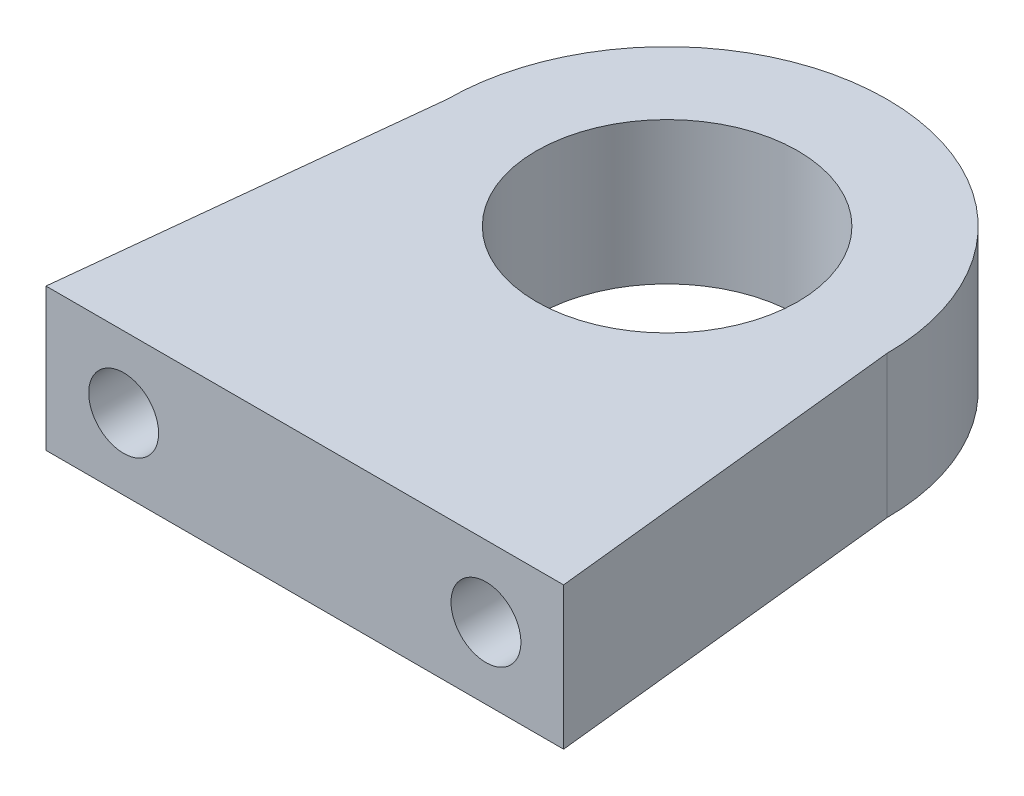
ISO-10303-21;
HEADER;
FILE_DESCRIPTION(('STEP AP214'),'2;1');
FILE_NAME('part.step','',(''),(''),'','','');
FILE_SCHEMA(('AUTOMOTIVE_DESIGN { 1 0 10303 214 1 1 1 1 }'));
ENDSEC;
DATA;
#1=APPLICATION_CONTEXT('core data for automotive mechanical design processes');
#2=APPLICATION_PROTOCOL_DEFINITION('international standard','automotive_design',2000,#1);
#3=PRODUCT_CONTEXT('',#1,'mechanical');
#4=PRODUCT('Part','Part','',(#3));
#5=PRODUCT_RELATED_PRODUCT_CATEGORY('part','',(#4));
#6=PRODUCT_DEFINITION_FORMATION('','',#4);
#7=PRODUCT_DEFINITION_CONTEXT('part definition',#1,'design');
#8=PRODUCT_DEFINITION('design','',#6,#7);
#9=PRODUCT_DEFINITION_SHAPE('','',#8);
#10=(LENGTH_UNIT() NAMED_UNIT(*) SI_UNIT(.MILLI.,.METRE.));
#11=(NAMED_UNIT(*) PLANE_ANGLE_UNIT() SI_UNIT($,.RADIAN.));
#12=(NAMED_UNIT(*) SI_UNIT($,.STERADIAN.) SOLID_ANGLE_UNIT());
#13=UNCERTAINTY_MEASURE_WITH_UNIT(LENGTH_MEASURE(1.E-05),#10,'distance_accuracy_value','');
#14=(GEOMETRIC_REPRESENTATION_CONTEXT(3) GLOBAL_UNCERTAINTY_ASSIGNED_CONTEXT((#13)) GLOBAL_UNIT_ASSIGNED_CONTEXT((#10,
#11,#12)) REPRESENTATION_CONTEXT('',''));
#15=CARTESIAN_POINT('',(0.,0.,0.));
#16=DIRECTION('',(0.,0.,1.));
#17=DIRECTION('',(1.,0.,0.));
#18=AXIS2_PLACEMENT_3D('',#15,#16,#17);
#19=CARTESIAN_POINT('',(0.,5.5,-14.));
#20=DIRECTION('',(0.,-1.,0.));
#21=DIRECTION('',(0.,0.,-1.));
#22=AXIS2_PLACEMENT_3D('',#19,#20,#21);
#23=PLANE('',#22);
#24=DIRECTION('',(1.,0.,0.));
#25=VECTOR('',#24,1.);
#26=CARTESIAN_POINT('',(-10.,5.5,0.));
#27=LINE('',#26,#25);
#28=CARTESIAN_POINT('',(-10.,5.5,0.));
#29=VERTEX_POINT('',#28);
#30=CARTESIAN_POINT('',(10.,5.5,0.));
#31=VERTEX_POINT('',#30);
#32=EDGE_CURVE('E96',#29,#31,#27,.T.);
#33=ORIENTED_EDGE('',*,*,#32,.T.);
#34=DIRECTION('',(-0.106533123634265,0.,-0.994309153919809));
#35=VECTOR('',#34,1.);
#36=CARTESIAN_POINT('',(10.,5.5,0.));
#37=LINE('',#36,#35);
#38=CARTESIAN_POINT('',(8.5,5.5,-14.));
#39=VERTEX_POINT('',#38);
#40=EDGE_CURVE('E91',#31,#39,#37,.T.);
#41=ORIENTED_EDGE('',*,*,#40,.T.);
#42=CARTESIAN_POINT('',(0.,5.5,-14.));
#43=DIRECTION('',(0.,1.,0.));
#44=DIRECTION('',(0.,0.,-1.));
#45=AXIS2_PLACEMENT_3D('',#42,#43,#44);
#46=CIRCLE('',#45,8.5);
#47=CARTESIAN_POINT('',(-8.5,5.5,-14.));
#48=VERTEX_POINT('',#47);
#49=EDGE_CURVE('E94',#39,#48,#46,.T.);
#50=ORIENTED_EDGE('',*,*,#49,.T.);
#51=DIRECTION('',(-0.106533123634265,0.,0.994309153919809));
#52=VECTOR('',#51,1.);
#53=CARTESIAN_POINT('',(-10.,5.5,0.));
#54=LINE('',#53,#52);
#55=EDGE_CURVE('E61',#48,#29,#54,.T.);
#56=ORIENTED_EDGE('',*,*,#55,.T.);
#57=EDGE_LOOP('',(#33,#41,#50,#56));
#58=FACE_BOUND('',#57,.T.);
#59=CARTESIAN_POINT('',(0.,5.5,-14.));
#60=DIRECTION('',(0.,1.,0.));
#61=DIRECTION('',(0.,0.,1.));
#62=AXIS2_PLACEMENT_3D('',#59,#60,#61);
#63=CIRCLE('',#62,5.05);
#64=CARTESIAN_POINT('',(0.,5.5,-8.95));
#65=VERTEX_POINT('',#64);
#66=EDGE_CURVE('E116',#65,#65,#63,.T.);
#67=ORIENTED_EDGE('',*,*,#66,.F.);
#68=EDGE_LOOP('',(#67));
#69=FACE_BOUND('',#68,.T.);
#70=ADVANCED_FACE('F43',(#58,#69),#23,.F.);
#71=CARTESIAN_POINT('',(0.,0.,-14.));
#72=DIRECTION('',(0.,-1.,0.));
#73=DIRECTION('',(0.,0.,-1.));
#74=AXIS2_PLACEMENT_3D('',#71,#72,#73);
#75=PLANE('',#74);
#76=DIRECTION('',(1.,0.,0.));
#77=VECTOR('',#76,1.);
#78=CARTESIAN_POINT('',(-10.,0.,0.));
#79=LINE('',#78,#77);
#80=CARTESIAN_POINT('',(-10.,0.,0.));
#81=VERTEX_POINT('',#80);
#82=CARTESIAN_POINT('',(10.,0.,0.));
#83=VERTEX_POINT('',#82);
#84=EDGE_CURVE('E112',#81,#83,#79,.T.);
#85=ORIENTED_EDGE('',*,*,#84,.F.);
#86=DIRECTION('',(-0.106533123634265,0.,0.994309153919809));
#87=VECTOR('',#86,1.);
#88=CARTESIAN_POINT('',(-10.,0.,0.));
#89=LINE('',#88,#87);
#90=CARTESIAN_POINT('',(-8.5,0.,-14.));
#91=VERTEX_POINT('',#90);
#92=EDGE_CURVE('E84',#91,#81,#89,.T.);
#93=ORIENTED_EDGE('',*,*,#92,.F.);
#94=CARTESIAN_POINT('',(0.,0.,-14.));
#95=DIRECTION('',(0.,1.,0.));
#96=DIRECTION('',(0.,0.,-1.));
#97=AXIS2_PLACEMENT_3D('',#94,#95,#96);
#98=CIRCLE('',#97,8.5);
#99=CARTESIAN_POINT('',(8.5,0.,-14.));
#100=VERTEX_POINT('',#99);
#101=EDGE_CURVE('E78',#100,#91,#98,.T.);
#102=ORIENTED_EDGE('',*,*,#101,.F.);
#103=DIRECTION('',(-0.106533123634265,0.,-0.994309153919809));
#104=VECTOR('',#103,1.);
#105=CARTESIAN_POINT('',(10.,0.,0.));
#106=LINE('',#105,#104);
#107=EDGE_CURVE('E101',#83,#100,#106,.T.);
#108=ORIENTED_EDGE('',*,*,#107,.F.);
#109=EDGE_LOOP('',(#85,#93,#102,#108));
#110=FACE_BOUND('',#109,.T.);
#111=CARTESIAN_POINT('',(0.,0.,-14.));
#112=DIRECTION('',(0.,1.,0.));
#113=DIRECTION('',(0.,0.,1.));
#114=AXIS2_PLACEMENT_3D('',#111,#112,#113);
#115=CIRCLE('',#114,5.05);
#116=CARTESIAN_POINT('',(0.,0.,-8.95));
#117=VERTEX_POINT('',#116);
#118=EDGE_CURVE('E134',#117,#117,#115,.T.);
#119=ORIENTED_EDGE('',*,*,#118,.T.);
#120=EDGE_LOOP('',(#119));
#121=FACE_BOUND('',#120,.T.);
#122=ADVANCED_FACE('F129',(#110,#121),#75,.T.);
#123=CARTESIAN_POINT('',(-10.,5.5,0.));
#124=DIRECTION('',(0.,0.,-1.));
#125=DIRECTION('',(-1.,0.,0.));
#126=AXIS2_PLACEMENT_3D('',#123,#124,#125);
#127=PLANE('',#126);
#128=CARTESIAN_POINT('',(-7.,2.75,0.));
#129=DIRECTION('',(0.,0.,1.));
#130=DIRECTION('',(1.,0.,0.));
#131=AXIS2_PLACEMENT_3D('',#128,#129,#130);
#132=CIRCLE('',#131,1.35);
#133=CARTESIAN_POINT('',(-5.65,2.75,0.));
#134=VERTEX_POINT('',#133);
#135=EDGE_CURVE('E150',#134,#134,#132,.T.);
#136=ORIENTED_EDGE('',*,*,#135,.F.);
#137=EDGE_LOOP('',(#136));
#138=FACE_BOUND('',#137,.T.);
#139=CARTESIAN_POINT('',(7.,2.75,0.));
#140=DIRECTION('',(0.,0.,1.));
#141=DIRECTION('',(-1.,0.,0.));
#142=AXIS2_PLACEMENT_3D('',#139,#140,#141);
#143=CIRCLE('',#142,1.35);
#144=CARTESIAN_POINT('',(5.65,2.75,0.));
#145=VERTEX_POINT('',#144);
#146=EDGE_CURVE('E142',#145,#145,#143,.T.);
#147=ORIENTED_EDGE('',*,*,#146,.F.);
#148=EDGE_LOOP('',(#147));
#149=FACE_BOUND('',#148,.T.);
#150=ORIENTED_EDGE('',*,*,#84,.T.);
#151=DIRECTION('',(0.,-1.,0.));
#152=VECTOR('',#151,1.);
#153=CARTESIAN_POINT('',(10.,5.5,0.));
#154=LINE('',#153,#152);
#155=EDGE_CURVE('E11',#31,#83,#154,.T.);
#156=ORIENTED_EDGE('',*,*,#155,.F.);
#157=ORIENTED_EDGE('',*,*,#32,.F.);
#158=DIRECTION('',(0.,-1.,0.));
#159=VECTOR('',#158,1.);
#160=CARTESIAN_POINT('',(-10.,5.5,0.));
#161=LINE('',#160,#159);
#162=EDGE_CURVE('E108',#29,#81,#161,.T.);
#163=ORIENTED_EDGE('',*,*,#162,.T.);
#164=EDGE_LOOP('',(#150,#156,#157,#163));
#165=FACE_BOUND('',#164,.T.);
#166=ADVANCED_FACE('F45',(#138,#149,#165),#127,.F.);
#167=CARTESIAN_POINT('',(10.,5.5,0.));
#168=DIRECTION('',(-0.994309153919809,0.,0.106533123634265));
#169=DIRECTION('',(0.106533123634265,0.,0.994309153919809));
#170=AXIS2_PLACEMENT_3D('',#167,#168,#169);
#171=PLANE('',#170);
#172=ORIENTED_EDGE('',*,*,#107,.T.);
#173=DIRECTION('',(0.,-1.,0.));
#174=VECTOR('',#173,1.);
#175=CARTESIAN_POINT('',(8.5,5.5,-14.));
#176=LINE('',#175,#174);
#177=EDGE_CURVE('E53',#39,#100,#176,.T.);
#178=ORIENTED_EDGE('',*,*,#177,.F.);
#179=ORIENTED_EDGE('',*,*,#40,.F.);
#180=ORIENTED_EDGE('',*,*,#155,.T.);
#181=EDGE_LOOP('',(#172,#178,#179,#180));
#182=FACE_BOUND('',#181,.T.);
#183=ADVANCED_FACE('F100',(#182),#171,.F.);
#184=CARTESIAN_POINT('',(0.,5.5,-14.));
#185=DIRECTION('',(0.,-1.,0.));
#186=DIRECTION('',(0.,0.,-1.));
#187=AXIS2_PLACEMENT_3D('',#184,#185,#186);
#188=CYLINDRICAL_SURFACE('',#187,8.5);
#189=ORIENTED_EDGE('',*,*,#101,.T.);
#190=DIRECTION('',(0.,-1.,0.));
#191=VECTOR('',#190,1.);
#192=CARTESIAN_POINT('',(-8.5,5.5,-14.));
#193=LINE('',#192,#191);
#194=EDGE_CURVE('E103',#48,#91,#193,.T.);
#195=ORIENTED_EDGE('',*,*,#194,.F.);
#196=ORIENTED_EDGE('',*,*,#49,.F.);
#197=ORIENTED_EDGE('',*,*,#177,.T.);
#198=EDGE_LOOP('',(#189,#195,#196,#197));
#199=FACE_BOUND('',#198,.T.);
#200=ADVANCED_FACE('F104',(#199),#188,.T.);
#201=CARTESIAN_POINT('',(-10.,5.5,0.));
#202=DIRECTION('',(0.994309153919809,0.,0.106533123634265));
#203=DIRECTION('',(0.106533123634265,0.,-0.994309153919809));
#204=AXIS2_PLACEMENT_3D('',#201,#202,#203);
#205=PLANE('',#204);
#206=ORIENTED_EDGE('',*,*,#92,.T.);
#207=ORIENTED_EDGE('',*,*,#162,.F.);
#208=ORIENTED_EDGE('',*,*,#55,.F.);
#209=ORIENTED_EDGE('',*,*,#194,.T.);
#210=EDGE_LOOP('',(#206,#207,#208,#209));
#211=FACE_BOUND('',#210,.T.);
#212=ADVANCED_FACE('F126',(#211),#205,.F.);
#213=CARTESIAN_POINT('',(0.,5.5,-14.));
#214=DIRECTION('',(0.,-1.,0.));
#215=DIRECTION('',(0.,0.,-1.));
#216=AXIS2_PLACEMENT_3D('',#213,#214,#215);
#217=CYLINDRICAL_SURFACE('',#216,5.05);
#218=ORIENTED_EDGE('',*,*,#66,.T.);
#219=EDGE_LOOP('',(#218));
#220=FACE_BOUND('',#219,.T.);
#221=ORIENTED_EDGE('',*,*,#118,.F.);
#222=EDGE_LOOP('',(#221));
#223=FACE_BOUND('',#222,.T.);
#224=ADVANCED_FACE('F173',(#220,#223),#217,.F.);
#225=CARTESIAN_POINT('',(7.,2.75,-10.));
#226=DIRECTION('',(0.,0.,1.));
#227=DIRECTION('',(1.,0.,0.));
#228=AXIS2_PLACEMENT_3D('',#225,#226,#227);
#229=CYLINDRICAL_SURFACE('',#228,1.35);
#230=CARTESIAN_POINT('',(7.,2.75,-10.));
#231=DIRECTION('',(0.,0.,1.));
#232=DIRECTION('',(-1.,0.,0.));
#233=AXIS2_PLACEMENT_3D('',#230,#231,#232);
#234=CIRCLE('',#233,1.35);
#235=CARTESIAN_POINT('',(5.65,2.75,-10.));
#236=VERTEX_POINT('',#235);
#237=EDGE_CURVE('E146',#236,#236,#234,.T.);
#238=ORIENTED_EDGE('',*,*,#237,.F.);
#239=EDGE_LOOP('',(#238));
#240=FACE_BOUND('',#239,.T.);
#241=ORIENTED_EDGE('',*,*,#146,.T.);
#242=EDGE_LOOP('',(#241));
#243=FACE_BOUND('',#242,.T.);
#244=ADVANCED_FACE('F171',(#240,#243),#229,.F.);
#245=CARTESIAN_POINT('',(7.,2.75,-10.));
#246=DIRECTION('',(0.,0.,-1.));
#247=DIRECTION('',(-1.,0.,0.));
#248=AXIS2_PLACEMENT_3D('',#245,#246,#247);
#249=PLANE('',#248);
#250=ORIENTED_EDGE('',*,*,#237,.T.);
#251=EDGE_LOOP('',(#250));
#252=FACE_BOUND('',#251,.T.);
#253=ADVANCED_FACE('F163',(#252),#249,.F.);
#254=CARTESIAN_POINT('',(-7.,2.75,-10.));
#255=DIRECTION('',(0.,0.,1.));
#256=DIRECTION('',(1.,0.,0.));
#257=AXIS2_PLACEMENT_3D('',#254,#255,#256);
#258=CYLINDRICAL_SURFACE('',#257,1.35);
#259=CARTESIAN_POINT('',(-7.,2.75,-10.));
#260=DIRECTION('',(0.,0.,1.));
#261=DIRECTION('',(1.,0.,0.));
#262=AXIS2_PLACEMENT_3D('',#259,#260,#261);
#263=CIRCLE('',#262,1.35);
#264=CARTESIAN_POINT('',(-5.65,2.75,-10.));
#265=VERTEX_POINT('',#264);
#266=EDGE_CURVE('E138',#265,#265,#263,.T.);
#267=ORIENTED_EDGE('',*,*,#266,.F.);
#268=EDGE_LOOP('',(#267));
#269=FACE_BOUND('',#268,.T.);
#270=ORIENTED_EDGE('',*,*,#135,.T.);
#271=EDGE_LOOP('',(#270));
#272=FACE_BOUND('',#271,.T.);
#273=ADVANCED_FACE('F160',(#269,#272),#258,.F.);
#274=CARTESIAN_POINT('',(-7.,2.75,-10.));
#275=DIRECTION('',(0.,0.,1.));
#276=DIRECTION('',(1.,0.,0.));
#277=AXIS2_PLACEMENT_3D('',#274,#275,#276);
#278=PLANE('',#277);
#279=ORIENTED_EDGE('',*,*,#266,.T.);
#280=EDGE_LOOP('',(#279));
#281=FACE_BOUND('',#280,.T.);
#282=ADVANCED_FACE('F158',(#281),#278,.T.);
#283=CLOSED_SHELL('',(#70,#122,#166,#183,#200,#212,#224,#244,#253,#273,#282));
#284=MANIFOLD_SOLID_BREP('B2',#283);
#285=ADVANCED_BREP_SHAPE_REPRESENTATION('',(#18,#284),#14);
#286=SHAPE_DEFINITION_REPRESENTATION(#9,#285);
ENDSEC;
END-ISO-10303-21;
